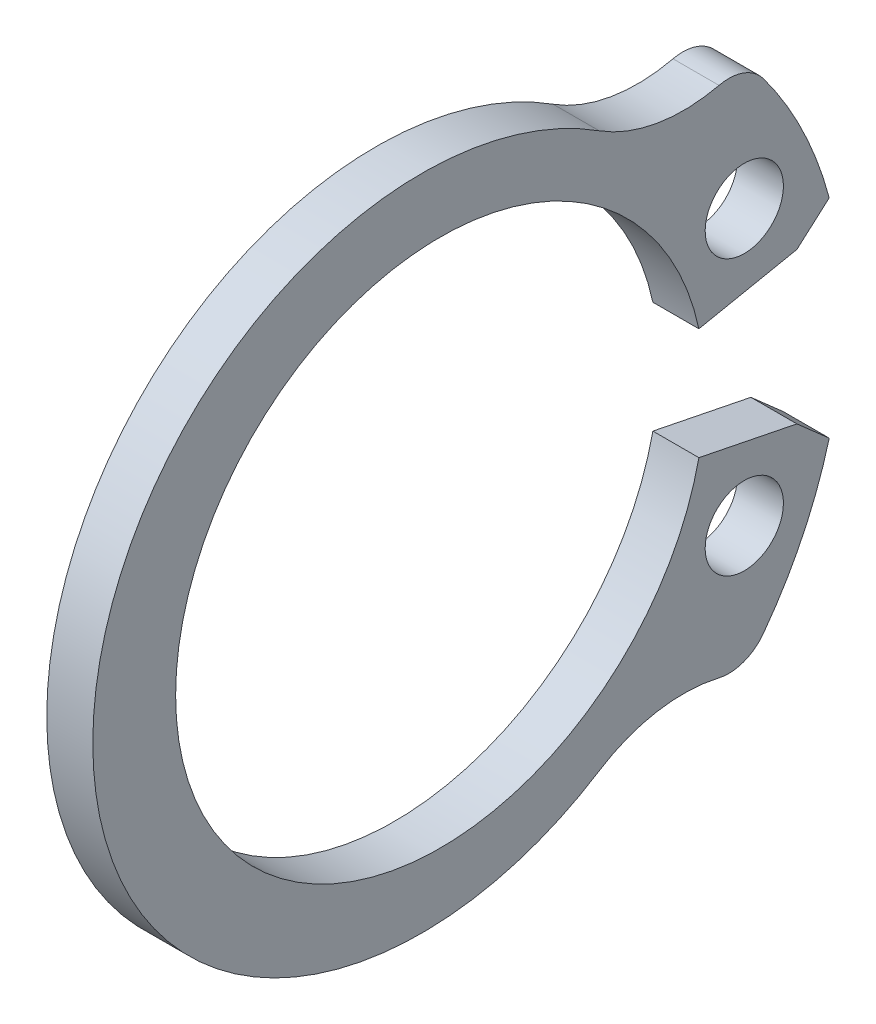
ISO-10303-21;
HEADER;
FILE_DESCRIPTION(('STEP AP214'),'2;1');
FILE_NAME('part.step','',(''),(''),'','','');
FILE_SCHEMA(('AUTOMOTIVE_DESIGN { 1 0 10303 214 1 1 1 1 }'));
ENDSEC;
DATA;
#1=APPLICATION_CONTEXT('core data for automotive mechanical design processes');
#2=APPLICATION_PROTOCOL_DEFINITION('international standard','automotive_design',2000,#1);
#3=PRODUCT_CONTEXT('',#1,'mechanical');
#4=PRODUCT('Part','Part','',(#3));
#5=PRODUCT_RELATED_PRODUCT_CATEGORY('part','',(#4));
#6=PRODUCT_DEFINITION_FORMATION('','',#4);
#7=PRODUCT_DEFINITION_CONTEXT('part definition',#1,'design');
#8=PRODUCT_DEFINITION('design','',#6,#7);
#9=PRODUCT_DEFINITION_SHAPE('','',#8);
#10=(LENGTH_UNIT() NAMED_UNIT(*) SI_UNIT(.MILLI.,.METRE.));
#11=(NAMED_UNIT(*) PLANE_ANGLE_UNIT() SI_UNIT($,.RADIAN.));
#12=(NAMED_UNIT(*) SI_UNIT($,.STERADIAN.) SOLID_ANGLE_UNIT());
#13=UNCERTAINTY_MEASURE_WITH_UNIT(LENGTH_MEASURE(1.E-05),#10,'distance_accuracy_value','');
#14=(GEOMETRIC_REPRESENTATION_CONTEXT(3) GLOBAL_UNCERTAINTY_ASSIGNED_CONTEXT((#13)) GLOBAL_UNIT_ASSIGNED_CONTEXT((#10,
#11,#12)) REPRESENTATION_CONTEXT('',''));
#15=CARTESIAN_POINT('',(0.,0.,0.));
#16=DIRECTION('',(0.,0.,1.));
#17=DIRECTION('',(1.,0.,0.));
#18=AXIS2_PLACEMENT_3D('',#15,#16,#17);
#19=CARTESIAN_POINT('',(-3.5,-2.985,-6.606986832135));
#20=DIRECTION('',(-1.,0.,0.));
#21=DIRECTION('',(0.,-1.,0.));
#22=AXIS2_PLACEMENT_3D('',#19,#20,#21);
#23=CYLINDRICAL_SURFACE('',#22,0.85);
#24=CARTESIAN_POINT('',(-3.,-2.985,-6.606986832135));
#25=DIRECTION('',(-1.,0.,0.));
#26=DIRECTION('',(0.,1.,0.));
#27=AXIS2_PLACEMENT_3D('',#24,#25,#26);
#28=CIRCLE('',#27,0.85);
#29=CARTESIAN_POINT('',(-3.,-2.135,-6.606986832135));
#30=VERTEX_POINT('',#29);
#31=EDGE_CURVE('E143',#30,#30,#28,.T.);
#32=ORIENTED_EDGE('',*,*,#31,.F.);
#33=DIRECTION('',(-1.,0.,0.));
#34=VECTOR('',#33,1.);
#35=CARTESIAN_POINT('',(-3.5,-2.135,-6.606986832135));
#36=LINE('',#35,#34);
#37=CARTESIAN_POINT('',(-4.,-2.135,-6.606986832135));
#38=VERTEX_POINT('',#37);
#39=EDGE_CURVE('E11',#30,#38,#36,.T.);
#40=ORIENTED_EDGE('',*,*,#39,.T.);
#41=CARTESIAN_POINT('',(-4.,-2.985,-6.606986832135));
#42=DIRECTION('',(1.,0.,0.));
#43=DIRECTION('',(0.,1.,0.));
#44=AXIS2_PLACEMENT_3D('',#41,#42,#43);
#45=CIRCLE('',#44,0.85);
#46=EDGE_CURVE('E250',#38,#38,#45,.T.);
#47=ORIENTED_EDGE('',*,*,#46,.F.);
#48=ORIENTED_EDGE('',*,*,#39,.F.);
#49=EDGE_LOOP('',(#32,#40,#47,#48));
#50=FACE_BOUND('',#49,.T.);
#51=ADVANCED_FACE('F17',(#50),#23,.F.);
#52=CARTESIAN_POINT('',(-3.5,2.985,-6.606986832135));
#53=DIRECTION('',(1.,0.,0.));
#54=DIRECTION('',(0.,1.,0.));
#55=AXIS2_PLACEMENT_3D('',#52,#53,#54);
#56=CYLINDRICAL_SURFACE('',#55,0.85);
#57=CARTESIAN_POINT('',(-4.,2.985,-6.606986832135));
#58=DIRECTION('',(1.,0.,0.));
#59=DIRECTION('',(0.,-1.,0.));
#60=AXIS2_PLACEMENT_3D('',#57,#58,#59);
#61=CIRCLE('',#60,0.85);
#62=CARTESIAN_POINT('',(-4.,2.135,-6.606986832135));
#63=VERTEX_POINT('',#62);
#64=EDGE_CURVE('E247',#63,#63,#61,.T.);
#65=ORIENTED_EDGE('',*,*,#64,.F.);
#66=DIRECTION('',(1.,0.,0.));
#67=VECTOR('',#66,1.);
#68=CARTESIAN_POINT('',(-3.5,2.135,-6.606986832135));
#69=LINE('',#68,#67);
#70=CARTESIAN_POINT('',(-3.,2.135,-6.606986832135));
#71=VERTEX_POINT('',#70);
#72=EDGE_CURVE('E28',#63,#71,#69,.T.);
#73=ORIENTED_EDGE('',*,*,#72,.T.);
#74=CARTESIAN_POINT('',(-3.,2.985,-6.606986832135));
#75=DIRECTION('',(-1.,0.,0.));
#76=DIRECTION('',(0.,-1.,0.));
#77=AXIS2_PLACEMENT_3D('',#74,#75,#76);
#78=CIRCLE('',#77,0.85);
#79=EDGE_CURVE('E153',#71,#71,#78,.T.);
#80=ORIENTED_EDGE('',*,*,#79,.F.);
#81=ORIENTED_EDGE('',*,*,#72,.F.);
#82=EDGE_LOOP('',(#65,#73,#80,#81));
#83=FACE_BOUND('',#82,.T.);
#84=ADVANCED_FACE('F597',(#83),#56,.F.);
#85=CARTESIAN_POINT('',(-3.,0.08054118737376,0.));
#86=DIRECTION('',(0.,-0.980324779329724,-0.197391304347805));
#87=DIRECTION('',(0.,0.197391304347805,-0.980324779329724));
#88=AXIS2_PLACEMENT_3D('',#85,#86,#87);
#89=PLANE('',#88);
#90=DIRECTION('',(1.,0.,0.));
#91=VECTOR('',#90,1.);
#92=CARTESIAN_POINT('',(-4.,1.212296024183,-5.620750692723));
#93=LINE('',#92,#91);
#94=CARTESIAN_POINT('',(-4.,1.212296024183,-5.620750692723));
#95=VERTEX_POINT('',#94);
#96=CARTESIAN_POINT('',(-3.,1.212296024183,-5.620750692723));
#97=VERTEX_POINT('',#96);
#98=EDGE_CURVE('E186',#95,#97,#93,.T.);
#99=ORIENTED_EDGE('',*,*,#98,.F.);
#100=DIRECTION('',(0.,-0.197391304347805,0.980324779329724));
#101=VECTOR('',#100,1.);
#102=CARTESIAN_POINT('',(-4.,1.64102669274,-7.75));
#103=LINE('',#102,#101);
#104=CARTESIAN_POINT('',(-4.,1.64102669274,-7.75));
#105=VERTEX_POINT('',#104);
#106=EDGE_CURVE('E208',#105,#95,#103,.T.);
#107=ORIENTED_EDGE('',*,*,#106,.F.);
#108=DIRECTION('',(1.,0.,0.));
#109=VECTOR('',#108,1.);
#110=CARTESIAN_POINT('',(-4.,1.64102669274,-7.75));
#111=LINE('',#110,#109);
#112=CARTESIAN_POINT('',(-3.,1.64102669274,-7.75));
#113=VERTEX_POINT('',#112);
#114=EDGE_CURVE('E21',#105,#113,#111,.T.);
#115=ORIENTED_EDGE('',*,*,#114,.T.);
#116=DIRECTION('',(0.,0.197391304347805,-0.980324779329724));
#117=VECTOR('',#116,1.);
#118=CARTESIAN_POINT('',(-3.,1.212296024183,-5.620750692723));
#119=LINE('',#118,#117);
#120=EDGE_CURVE('E182',#97,#113,#119,.T.);
#121=ORIENTED_EDGE('',*,*,#120,.F.);
#122=EDGE_LOOP('',(#99,#107,#115,#121));
#123=FACE_BOUND('',#122,.T.);
#124=ADVANCED_FACE('F353',(#123),#89,.T.);
#125=CARTESIAN_POINT('',(-3.,1.64102669274,-7.75));
#126=DIRECTION('',(0.,-0.750290510685011,-0.661108273716209));
#127=DIRECTION('',(0.,0.661108273716209,-0.750290510685011));
#128=AXIS2_PLACEMENT_3D('',#125,#126,#127);
#129=PLANE('',#128);
#130=DIRECTION('',(0.,-0.661108273716209,0.75029051068501));
#131=VECTOR('',#130,1.);
#132=CARTESIAN_POINT('',(-4.,2.260448129565,-8.452980199524));
#133=LINE('',#132,#131);
#134=CARTESIAN_POINT('',(-4.,2.260448129565,-8.452980199524));
#135=VERTEX_POINT('',#134);
#136=EDGE_CURVE('E209',#135,#105,#133,.T.);
#137=ORIENTED_EDGE('',*,*,#136,.F.);
#138=DIRECTION('',(-1.,0.,0.));
#139=VECTOR('',#138,1.);
#140=CARTESIAN_POINT('',(-3.,2.260448129565,-8.452980199524));
#141=LINE('',#140,#139);
#142=CARTESIAN_POINT('',(-3.,2.260448129565,-8.452980199524));
#143=VERTEX_POINT('',#142);
#144=EDGE_CURVE('E233',#143,#135,#141,.T.);
#145=ORIENTED_EDGE('',*,*,#144,.F.);
#146=DIRECTION('',(0.,0.661108273716209,-0.75029051068501));
#147=VECTOR('',#146,1.);
#148=CARTESIAN_POINT('',(-3.,1.64102669274,-7.75));
#149=LINE('',#148,#147);
#150=EDGE_CURVE('E223',#113,#143,#149,.T.);
#151=ORIENTED_EDGE('',*,*,#150,.F.);
#152=ORIENTED_EDGE('',*,*,#114,.F.);
#153=EDGE_LOOP('',(#137,#145,#151,#152));
#154=FACE_BOUND('',#153,.T.);
#155=ADVANCED_FACE('F347',(#154),#129,.T.);
#156=CARTESIAN_POINT('',(-3.,0.,0.));
#157=DIRECTION('',(1.,0.,0.));
#158=DIRECTION('',(0.,1.,0.));
#159=AXIS2_PLACEMENT_3D('',#156,#157,#158);
#160=CYLINDRICAL_SURFACE('',#159,8.75);
#161=CARTESIAN_POINT('',(-4.,0.,0.));
#162=DIRECTION('',(-1.,0.,0.));
#163=DIRECTION('',(0.,0.596880518276586,-0.802330135855481));
#164=AXIS2_PLACEMENT_3D('',#161,#162,#163);
#165=CIRCLE('',#164,8.75);
#166=CARTESIAN_POINT('',(-4.,5.22258458944409,-7.02047989357637));
#167=VERTEX_POINT('',#166);
#168=EDGE_CURVE('E212',#167,#135,#165,.T.);
#169=ORIENTED_EDGE('',*,*,#168,.F.);
#170=DIRECTION('',(1.,0.,0.));
#171=VECTOR('',#170,1.);
#172=CARTESIAN_POINT('',(-4.,5.22258648271,-7.020482438415));
#173=LINE('',#172,#171);
#174=CARTESIAN_POINT('',(-3.,5.22258458944409,-7.02047989357637));
#175=VERTEX_POINT('',#174);
#176=EDGE_CURVE('E236',#167,#175,#173,.T.);
#177=ORIENTED_EDGE('',*,*,#176,.T.);
#178=CARTESIAN_POINT('',(-3.,0.,0.));
#179=DIRECTION('',(1.,0.,0.));
#180=DIRECTION('',(0.,0.258336929093105,-0.966054879945619));
#181=AXIS2_PLACEMENT_3D('',#178,#179,#180);
#182=CIRCLE('',#181,8.75);
#183=EDGE_CURVE('E232',#143,#175,#182,.T.);
#184=ORIENTED_EDGE('',*,*,#183,.F.);
#185=ORIENTED_EDGE('',*,*,#144,.T.);
#186=EDGE_LOOP('',(#169,#177,#184,#185));
#187=FACE_BOUND('',#186,.T.);
#188=ADVANCED_FACE('F350',(#187),#160,.T.);
#189=CARTESIAN_POINT('',(-3.,4.664459290107,-6.270330496149));
#190=DIRECTION('',(1.,0.,0.));
#191=DIRECTION('',(0.,1.,0.));
#192=AXIS2_PLACEMENT_3D('',#189,#190,#191);
#193=CYLINDRICAL_SURFACE('',#192,0.935);
#194=CARTESIAN_POINT('',(-4.,4.664459290107,-6.270330496149));
#195=DIRECTION('',(-1.,0.,0.));
#196=DIRECTION('',(0.,1.,0.));
#197=AXIS2_PLACEMENT_3D('',#194,#195,#196);
#198=CIRCLE('',#197,0.935);
#199=CARTESIAN_POINT('',(-4.,5.575058836131,-6.058119594491));
#200=VERTEX_POINT('',#199);
#201=EDGE_CURVE('E241',#200,#167,#198,.T.);
#202=ORIENTED_EDGE('',*,*,#201,.F.);
#203=DIRECTION('',(1.,0.,0.));
#204=VECTOR('',#203,1.);
#205=CARTESIAN_POINT('',(-4.,5.575058836131,-6.058119594491));
#206=LINE('',#205,#204);
#207=CARTESIAN_POINT('',(-3.,5.575058836131,-6.058119594491));
#208=VERTEX_POINT('',#207);
#209=EDGE_CURVE('E219',#200,#208,#206,.T.);
#210=ORIENTED_EDGE('',*,*,#209,.T.);
#211=CARTESIAN_POINT('',(-3.,4.664459290107,-6.270330496149));
#212=DIRECTION('',(1.,0.,0.));
#213=DIRECTION('',(0.,1.,0.));
#214=AXIS2_PLACEMENT_3D('',#211,#212,#213);
#215=CIRCLE('',#214,0.935);
#216=EDGE_CURVE('E258',#175,#208,#215,.T.);
#217=ORIENTED_EDGE('',*,*,#216,.F.);
#218=ORIENTED_EDGE('',*,*,#176,.F.);
#219=EDGE_LOOP('',(#202,#210,#217,#218));
#220=FACE_BOUND('',#219,.T.);
#221=ADVANCED_FACE('F563',(#220),#193,.T.);
#222=CARTESIAN_POINT('',(-3.,8.886329912579,-5.286443588465));
#223=DIRECTION('',(1.,0.,0.));
#224=DIRECTION('',(0.,-0.985560224361013,0.169325261427437));
#225=AXIS2_PLACEMENT_3D('',#222,#223,#224);
#226=CYLINDRICAL_SURFACE('',#225,3.4);
#227=CARTESIAN_POINT('',(-4.,8.886329912579,-5.286443588465));
#228=DIRECTION('',(1.,0.,0.));
#229=DIRECTION('',(0.,-1.,0.));
#230=AXIS2_PLACEMENT_3D('',#227,#228,#229);
#231=CIRCLE('',#230,3.4);
#232=CARTESIAN_POINT('',(-4.,6.022488992885,-3.453845654742));
#233=VERTEX_POINT('',#232);
#234=EDGE_CURVE('E196',#233,#200,#231,.T.);
#235=ORIENTED_EDGE('',*,*,#234,.F.);
#236=DIRECTION('',(1.,0.,0.));
#237=VECTOR('',#236,1.);
#238=CARTESIAN_POINT('',(-4.,6.022488992885,-3.453845654742));
#239=LINE('',#238,#237);
#240=CARTESIAN_POINT('',(-3.,6.022488992885,-3.453845654742));
#241=VERTEX_POINT('',#240);
#242=EDGE_CURVE('E224',#233,#241,#239,.T.);
#243=ORIENTED_EDGE('',*,*,#242,.T.);
#244=CARTESIAN_POINT('',(-3.,8.886329912579,-5.286443588465));
#245=DIRECTION('',(-1.,0.,0.));
#246=DIRECTION('',(0.,-1.,0.));
#247=AXIS2_PLACEMENT_3D('',#244,#245,#246);
#248=CIRCLE('',#247,3.4);
#249=EDGE_CURVE('E166',#208,#241,#248,.T.);
#250=ORIENTED_EDGE('',*,*,#249,.F.);
#251=ORIENTED_EDGE('',*,*,#209,.F.);
#252=EDGE_LOOP('',(#235,#243,#250,#251));
#253=FACE_BOUND('',#252,.T.);
#254=ADVANCED_FACE('F318',(#253),#226,.F.);
#255=CARTESIAN_POINT('',(-4.,-8.886329912579,-5.286443588465));
#256=DIRECTION('',(-1.,0.,0.));
#257=DIRECTION('',(0.,0.985560224361013,0.169325261427437));
#258=AXIS2_PLACEMENT_3D('',#255,#256,#257);
#259=CYLINDRICAL_SURFACE('',#258,3.4);
#260=CARTESIAN_POINT('',(-4.,-8.886329912579,-5.286443588465));
#261=DIRECTION('',(1.,0.,0.));
#262=DIRECTION('',(0.,1.,0.));
#263=AXIS2_PLACEMENT_3D('',#260,#261,#262);
#264=CIRCLE('',#263,3.4);
#265=CARTESIAN_POINT('',(-4.,-5.575058836131,-6.058119594491));
#266=VERTEX_POINT('',#265);
#267=CARTESIAN_POINT('',(-4.,-6.022488992885,-3.453845654742));
#268=VERTEX_POINT('',#267);
#269=EDGE_CURVE('E188',#266,#268,#264,.T.);
#270=ORIENTED_EDGE('',*,*,#269,.F.);
#271=DIRECTION('',(-1.,0.,0.));
#272=VECTOR('',#271,1.);
#273=CARTESIAN_POINT('',(-3.,-5.575058836131,-6.058119594491));
#274=LINE('',#273,#272);
#275=CARTESIAN_POINT('',(-3.,-5.575058836131,-6.058119594491));
#276=VERTEX_POINT('',#275);
#277=EDGE_CURVE('E142',#276,#266,#274,.T.);
#278=ORIENTED_EDGE('',*,*,#277,.F.);
#279=CARTESIAN_POINT('',(-3.,-8.886329912579,-5.286443588465));
#280=DIRECTION('',(-1.,0.,0.));
#281=DIRECTION('',(0.,1.,0.));
#282=AXIS2_PLACEMENT_3D('',#279,#280,#281);
#283=CIRCLE('',#282,3.4);
#284=CARTESIAN_POINT('',(-3.,-6.022488992885,-3.453845654742));
#285=VERTEX_POINT('',#284);
#286=EDGE_CURVE('E159',#285,#276,#283,.T.);
#287=ORIENTED_EDGE('',*,*,#286,.F.);
#288=DIRECTION('',(-1.,0.,0.));
#289=VECTOR('',#288,1.);
#290=CARTESIAN_POINT('',(-3.,-6.022488992885,-3.453845654742));
#291=LINE('',#290,#289);
#292=EDGE_CURVE('E171',#285,#268,#291,.T.);
#293=ORIENTED_EDGE('',*,*,#292,.T.);
#294=EDGE_LOOP('',(#270,#278,#287,#293));
#295=FACE_BOUND('',#294,.T.);
#296=ADVANCED_FACE('F19',(#295),#259,.F.);
#297=CARTESIAN_POINT('',(-4.,-4.664459290107,-6.270330496149));
#298=DIRECTION('',(-1.,0.,0.));
#299=DIRECTION('',(0.,-1.,0.));
#300=AXIS2_PLACEMENT_3D('',#297,#298,#299);
#301=CYLINDRICAL_SURFACE('',#300,0.935);
#302=CARTESIAN_POINT('',(-4.,-4.664459290107,-6.270330496149));
#303=DIRECTION('',(-1.,0.,0.));
#304=DIRECTION('',(0.,-1.,0.));
#305=AXIS2_PLACEMENT_3D('',#302,#303,#304);
#306=CIRCLE('',#305,0.935);
#307=CARTESIAN_POINT('',(-4.,-5.22258464397422,-7.02047985300796));
#308=VERTEX_POINT('',#307);
#309=EDGE_CURVE('E137',#308,#266,#306,.T.);
#310=ORIENTED_EDGE('',*,*,#309,.F.);
#311=DIRECTION('',(-1.,0.,0.));
#312=VECTOR('',#311,1.);
#313=CARTESIAN_POINT('',(-3.,-5.22258648271,-7.020482438415));
#314=LINE('',#313,#312);
#315=CARTESIAN_POINT('',(-3.,-5.22258464397422,-7.02047985300796));
#316=VERTEX_POINT('',#315);
#317=EDGE_CURVE('E130',#316,#308,#314,.T.);
#318=ORIENTED_EDGE('',*,*,#317,.F.);
#319=CARTESIAN_POINT('',(-3.,-4.664459290107,-6.270330496149));
#320=DIRECTION('',(1.,0.,0.));
#321=DIRECTION('',(0.,-1.,0.));
#322=AXIS2_PLACEMENT_3D('',#319,#320,#321);
#323=CIRCLE('',#322,0.935);
#324=EDGE_CURVE('E134',#276,#316,#323,.T.);
#325=ORIENTED_EDGE('',*,*,#324,.F.);
#326=ORIENTED_EDGE('',*,*,#277,.T.);
#327=EDGE_LOOP('',(#310,#318,#325,#326));
#328=FACE_BOUND('',#327,.T.);
#329=ADVANCED_FACE('F132',(#328),#301,.T.);
#330=CARTESIAN_POINT('',(-4.,0.,0.));
#331=DIRECTION('',(-1.,0.,0.));
#332=DIRECTION('',(0.,-1.,0.));
#333=AXIS2_PLACEMENT_3D('',#330,#331,#332);
#334=CYLINDRICAL_SURFACE('',#333,8.75);
#335=CARTESIAN_POINT('',(-3.,0.,0.));
#336=DIRECTION('',(1.,0.,0.));
#337=DIRECTION('',(0.,-0.596880518276586,-0.802330135855481));
#338=AXIS2_PLACEMENT_3D('',#335,#336,#337);
#339=CIRCLE('',#338,8.75);
#340=CARTESIAN_POINT('',(-3.,-2.260448129565,-8.452980199524));
#341=VERTEX_POINT('',#340);
#342=EDGE_CURVE('E147',#316,#341,#339,.T.);
#343=ORIENTED_EDGE('',*,*,#342,.F.);
#344=ORIENTED_EDGE('',*,*,#317,.T.);
#345=CARTESIAN_POINT('',(-4.,0.,0.));
#346=DIRECTION('',(-1.,0.,0.));
#347=DIRECTION('',(0.,-0.258336929093105,-0.966054879945619));
#348=AXIS2_PLACEMENT_3D('',#345,#346,#347);
#349=CIRCLE('',#348,8.75);
#350=CARTESIAN_POINT('',(-4.,-2.260448129565,-8.452980199524));
#351=VERTEX_POINT('',#350);
#352=EDGE_CURVE('E189',#351,#308,#349,.T.);
#353=ORIENTED_EDGE('',*,*,#352,.F.);
#354=DIRECTION('',(1.,0.,0.));
#355=VECTOR('',#354,1.);
#356=CARTESIAN_POINT('',(-4.,-2.260448129565,-8.452980199524));
#357=LINE('',#356,#355);
#358=EDGE_CURVE('E149',#351,#341,#357,.T.);
#359=ORIENTED_EDGE('',*,*,#358,.T.);
#360=EDGE_LOOP('',(#343,#344,#353,#359));
#361=FACE_BOUND('',#360,.T.);
#362=ADVANCED_FACE('F148',(#361),#334,.T.);
#363=CARTESIAN_POINT('',(-3.,3.037006998616,-0.2102705557849));
#364=DIRECTION('',(-1.,0.,0.));
#365=DIRECTION('',(0.,0.,1.));
#366=AXIS2_PLACEMENT_3D('',#363,#364,#365);
#367=PLANE('',#366);
#368=ORIENTED_EDGE('',*,*,#31,.T.);
#369=EDGE_LOOP('',(#368));
#370=FACE_BOUND('',#369,.T.);
#371=ORIENTED_EDGE('',*,*,#79,.T.);
#372=EDGE_LOOP('',(#371));
#373=FACE_BOUND('',#372,.T.);
#374=CARTESIAN_POINT('',(-3.,0.,0.));
#375=DIRECTION('',(-1.,0.,0.));
#376=DIRECTION('',(0.,-0.21083409116229,-0.977521859604056));
#377=AXIS2_PLACEMENT_3D('',#374,#375,#376);
#378=CIRCLE('',#377,5.75);
#379=CARTESIAN_POINT('',(-3.,-1.212296024183,-5.620750692723));
#380=VERTEX_POINT('',#379);
#381=EDGE_CURVE('E183',#380,#97,#378,.T.);
#382=ORIENTED_EDGE('',*,*,#381,.T.);
#383=ORIENTED_EDGE('',*,*,#120,.T.);
#384=ORIENTED_EDGE('',*,*,#150,.T.);
#385=ORIENTED_EDGE('',*,*,#183,.T.);
#386=ORIENTED_EDGE('',*,*,#216,.T.);
#387=ORIENTED_EDGE('',*,*,#249,.T.);
#388=CARTESIAN_POINT('',(-3.,0.,0.4));
#389=DIRECTION('',(1.,0.,0.));
#390=DIRECTION('',(0.,0.842306152851111,-0.538999392271607));
#391=AXIS2_PLACEMENT_3D('',#388,#389,#390);
#392=CIRCLE('',#391,7.15);
#393=EDGE_CURVE('E175',#241,#285,#392,.T.);
#394=ORIENTED_EDGE('',*,*,#393,.T.);
#395=ORIENTED_EDGE('',*,*,#286,.T.);
#396=ORIENTED_EDGE('',*,*,#324,.T.);
#397=ORIENTED_EDGE('',*,*,#342,.T.);
#398=DIRECTION('',(0.,0.661108273716209,0.75029051068501));
#399=VECTOR('',#398,1.);
#400=CARTESIAN_POINT('',(-3.,-2.260448129565,-8.452980199524));
#401=LINE('',#400,#399);
#402=CARTESIAN_POINT('',(-3.,-1.64102669274,-7.75));
#403=VERTEX_POINT('',#402);
#404=EDGE_CURVE('E170',#341,#403,#401,.T.);
#405=ORIENTED_EDGE('',*,*,#404,.T.);
#406=DIRECTION('',(0.,0.197391304347805,0.980324779329724));
#407=VECTOR('',#406,1.);
#408=CARTESIAN_POINT('',(-3.,-1.64102669274,-7.75));
#409=LINE('',#408,#407);
#410=EDGE_CURVE('E237',#403,#380,#409,.T.);
#411=ORIENTED_EDGE('',*,*,#410,.T.);
#412=EDGE_LOOP('',(#382,#383,#384,#385,#386,#387,#394,#395,#396,#397,#405,#411));
#413=FACE_BOUND('',#412,.T.);
#414=ADVANCED_FACE('F156',(#370,#373,#413),#367,.F.);
#415=CARTESIAN_POINT('',(-4.,-1.64102669274,-7.75));
#416=DIRECTION('',(0.,0.750290510685011,-0.661108273716209));
#417=DIRECTION('',(-1.,0.,0.));
#418=AXIS2_PLACEMENT_3D('',#415,#416,#417);
#419=PLANE('',#418);
#420=ORIENTED_EDGE('',*,*,#404,.F.);
#421=ORIENTED_EDGE('',*,*,#358,.F.);
#422=DIRECTION('',(0.,-0.661108273716209,-0.75029051068501));
#423=VECTOR('',#422,1.);
#424=CARTESIAN_POINT('',(-4.,-1.64102669274,-7.75));
#425=LINE('',#424,#423);
#426=CARTESIAN_POINT('',(-4.,-1.64102669274,-7.75));
#427=VERTEX_POINT('',#426);
#428=EDGE_CURVE('E198',#427,#351,#425,.T.);
#429=ORIENTED_EDGE('',*,*,#428,.F.);
#430=DIRECTION('',(-1.,0.,0.));
#431=VECTOR('',#430,1.);
#432=CARTESIAN_POINT('',(-3.,-1.64102669274,-7.75));
#433=LINE('',#432,#431);
#434=EDGE_CURVE('E240',#403,#427,#433,.T.);
#435=ORIENTED_EDGE('',*,*,#434,.F.);
#436=EDGE_LOOP('',(#420,#421,#429,#435));
#437=FACE_BOUND('',#436,.T.);
#438=ADVANCED_FACE('F509',(#437),#419,.T.);
#439=CARTESIAN_POINT('',(-4.,-0.08054118737376,0.));
#440=DIRECTION('',(0.,0.980324779329724,-0.197391304347805));
#441=DIRECTION('',(-1.,0.,0.));
#442=AXIS2_PLACEMENT_3D('',#439,#440,#441);
#443=PLANE('',#442);
#444=DIRECTION('',(-1.,0.,0.));
#445=VECTOR('',#444,1.);
#446=CARTESIAN_POINT('',(-3.,-1.212296024183,-5.620750692723));
#447=LINE('',#446,#445);
#448=CARTESIAN_POINT('',(-4.,-1.212296024183,-5.620750692723));
#449=VERTEX_POINT('',#448);
#450=EDGE_CURVE('E185',#380,#449,#447,.T.);
#451=ORIENTED_EDGE('',*,*,#450,.F.);
#452=ORIENTED_EDGE('',*,*,#410,.F.);
#453=ORIENTED_EDGE('',*,*,#434,.T.);
#454=DIRECTION('',(0.,-0.197391304347805,-0.980324779329724));
#455=VECTOR('',#454,1.);
#456=CARTESIAN_POINT('',(-4.,-1.212296024183,-5.620750692723));
#457=LINE('',#456,#455);
#458=EDGE_CURVE('E204',#449,#427,#457,.T.);
#459=ORIENTED_EDGE('',*,*,#458,.F.);
#460=EDGE_LOOP('',(#451,#452,#453,#459));
#461=FACE_BOUND('',#460,.T.);
#462=ADVANCED_FACE('F498',(#461),#443,.T.);
#463=CARTESIAN_POINT('',(-3.5,0.,0.));
#464=DIRECTION('',(1.,0.,0.));
#465=DIRECTION('',(0.,0.,1.));
#466=AXIS2_PLACEMENT_3D('',#463,#464,#465);
#467=CYLINDRICAL_SURFACE('',#466,5.75);
#468=CARTESIAN_POINT('',(-4.,0.,0.));
#469=DIRECTION('',(1.,0.,0.));
#470=DIRECTION('',(0.,-1.,0.));
#471=AXIS2_PLACEMENT_3D('',#468,#469,#470);
#472=CIRCLE('',#471,5.75);
#473=EDGE_CURVE('E228',#95,#449,#472,.T.);
#474=ORIENTED_EDGE('',*,*,#473,.F.);
#475=ORIENTED_EDGE('',*,*,#98,.T.);
#476=ORIENTED_EDGE('',*,*,#381,.F.);
#477=ORIENTED_EDGE('',*,*,#450,.T.);
#478=EDGE_LOOP('',(#474,#475,#476,#477));
#479=FACE_BOUND('',#478,.T.);
#480=ADVANCED_FACE('F291',(#479),#467,.F.);
#481=CARTESIAN_POINT('',(-4.,3.037006998616,-0.2102705557849));
#482=DIRECTION('',(-1.,0.,0.));
#483=DIRECTION('',(0.,0.,1.));
#484=AXIS2_PLACEMENT_3D('',#481,#482,#483);
#485=PLANE('',#484);
#486=ORIENTED_EDGE('',*,*,#64,.T.);
#487=EDGE_LOOP('',(#486));
#488=FACE_BOUND('',#487,.T.);
#489=ORIENTED_EDGE('',*,*,#46,.T.);
#490=EDGE_LOOP('',(#489));
#491=FACE_BOUND('',#490,.T.);
#492=ORIENTED_EDGE('',*,*,#473,.T.);
#493=ORIENTED_EDGE('',*,*,#458,.T.);
#494=ORIENTED_EDGE('',*,*,#428,.T.);
#495=ORIENTED_EDGE('',*,*,#352,.T.);
#496=ORIENTED_EDGE('',*,*,#309,.T.);
#497=ORIENTED_EDGE('',*,*,#269,.T.);
#498=CARTESIAN_POINT('',(-4.,0.,0.4));
#499=DIRECTION('',(-1.,0.,0.));
#500=DIRECTION('',(0.,-0.842306152851111,-0.538999392271607));
#501=AXIS2_PLACEMENT_3D('',#498,#499,#500);
#502=CIRCLE('',#501,7.15);
#503=EDGE_CURVE('E176',#268,#233,#502,.T.);
#504=ORIENTED_EDGE('',*,*,#503,.T.);
#505=ORIENTED_EDGE('',*,*,#234,.T.);
#506=ORIENTED_EDGE('',*,*,#201,.T.);
#507=ORIENTED_EDGE('',*,*,#168,.T.);
#508=ORIENTED_EDGE('',*,*,#136,.T.);
#509=ORIENTED_EDGE('',*,*,#106,.T.);
#510=EDGE_LOOP('',(#492,#493,#494,#495,#496,#497,#504,#505,#506,#507,#508,#509));
#511=FACE_BOUND('',#510,.T.);
#512=ADVANCED_FACE('F288',(#488,#491,#511),#485,.T.);
#513=CARTESIAN_POINT('',(-3.,0.,0.4));
#514=DIRECTION('',(1.,0.,0.));
#515=DIRECTION('',(0.,0.,1.));
#516=AXIS2_PLACEMENT_3D('',#513,#514,#515);
#517=CYLINDRICAL_SURFACE('',#516,7.15);
#518=ORIENTED_EDGE('',*,*,#503,.F.);
#519=ORIENTED_EDGE('',*,*,#292,.F.);
#520=ORIENTED_EDGE('',*,*,#393,.F.);
#521=ORIENTED_EDGE('',*,*,#242,.F.);
#522=EDGE_LOOP('',(#518,#519,#520,#521));
#523=FACE_BOUND('',#522,.T.);
#524=ADVANCED_FACE('F290',(#523),#517,.T.);
#525=CLOSED_SHELL('',(#51,#84,#124,#155,#188,#221,#254,#296,#329,#362,#414,#438,#462,#480,#512,#524));
#526=MANIFOLD_SOLID_BREP('B1',#525);
#527=ADVANCED_BREP_SHAPE_REPRESENTATION('',(#18,#526),#14);
#528=SHAPE_DEFINITION_REPRESENTATION(#9,#527);
ENDSEC;
END-ISO-10303-21;
